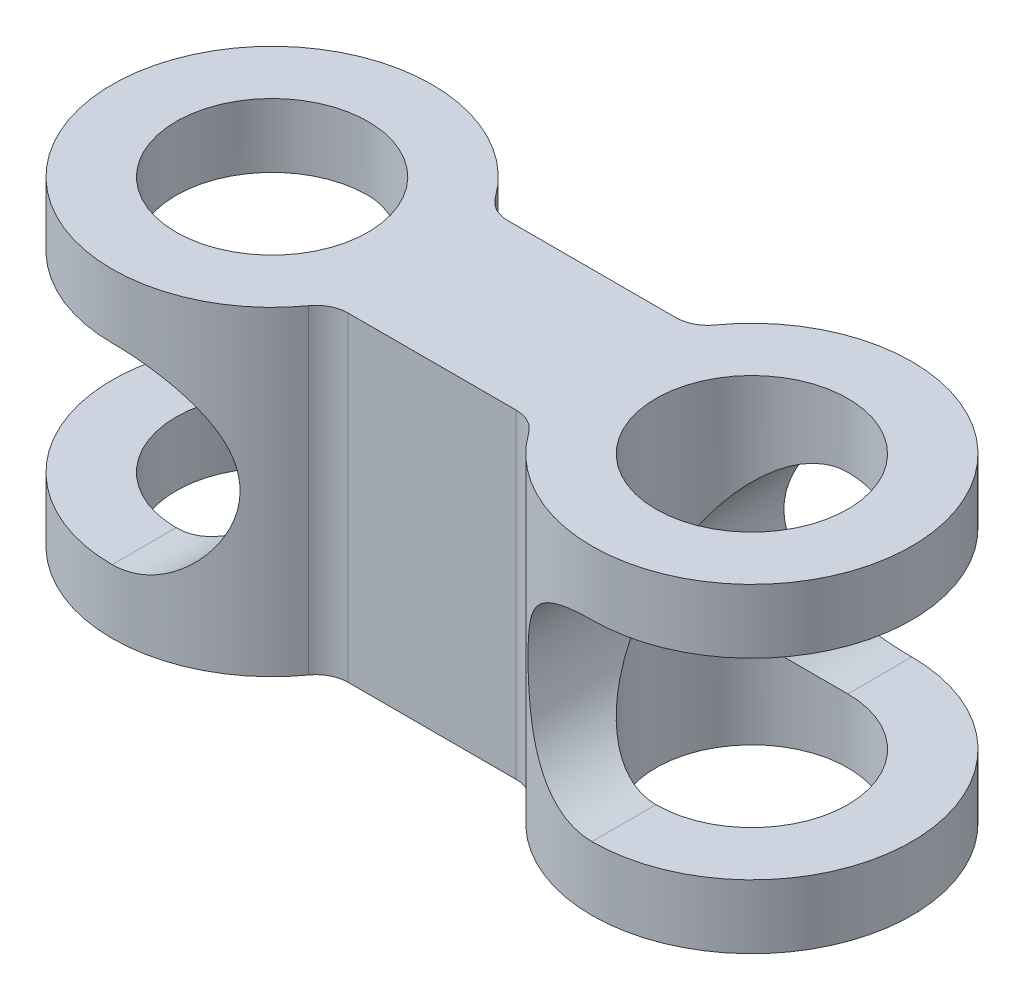
ISO-10303-21;
HEADER;
FILE_DESCRIPTION(('STEP AP214'),'2;1');
FILE_NAME('part.step','',(''),(''),'','','');
FILE_SCHEMA(('AUTOMOTIVE_DESIGN { 1 0 10303 214 1 1 1 1 }'));
ENDSEC;
DATA;
#1=APPLICATION_CONTEXT('core data for automotive mechanical design processes');
#2=APPLICATION_PROTOCOL_DEFINITION('international standard','automotive_design',2000,#1);
#3=PRODUCT_CONTEXT('',#1,'mechanical');
#4=PRODUCT('Part','Part','',(#3));
#5=PRODUCT_RELATED_PRODUCT_CATEGORY('part','',(#4));
#6=PRODUCT_DEFINITION_FORMATION('','',#4);
#7=PRODUCT_DEFINITION_CONTEXT('part definition',#1,'design');
#8=PRODUCT_DEFINITION('design','',#6,#7);
#9=PRODUCT_DEFINITION_SHAPE('','',#8);
#10=(LENGTH_UNIT() NAMED_UNIT(*) SI_UNIT(.MILLI.,.METRE.));
#11=(NAMED_UNIT(*) PLANE_ANGLE_UNIT() SI_UNIT($,.RADIAN.));
#12=(NAMED_UNIT(*) SI_UNIT($,.STERADIAN.) SOLID_ANGLE_UNIT());
#13=UNCERTAINTY_MEASURE_WITH_UNIT(LENGTH_MEASURE(1.E-05),#10,'distance_accuracy_value','');
#14=(GEOMETRIC_REPRESENTATION_CONTEXT(3) GLOBAL_UNCERTAINTY_ASSIGNED_CONTEXT((#13)) GLOBAL_UNIT_ASSIGNED_CONTEXT((#10,
#11,#12)) REPRESENTATION_CONTEXT('',''));
#15=CARTESIAN_POINT('',(0.,0.,0.));
#16=DIRECTION('',(0.,0.,1.));
#17=DIRECTION('',(1.,0.,0.));
#18=AXIS2_PLACEMENT_3D('',#15,#16,#17);
#19=CARTESIAN_POINT('',(15.,24.142135623731,0.));
#20=DIRECTION('',(0.,-1.,0.));
#21=DIRECTION('',(0.,0.,-1.));
#22=AXIS2_PLACEMENT_3D('',#19,#20,#21);
#23=CYLINDRICAL_SURFACE('',#22,5.);
#24=CARTESIAN_POINT('',(15.,0.,0.));
#25=DIRECTION('',(0.,-1.,0.));
#26=DIRECTION('',(0.,0.,1.));
#27=AXIS2_PLACEMENT_3D('',#24,#25,#26);
#28=CIRCLE('',#27,5.);
#29=CARTESIAN_POINT('',(10.9388356896629,0.,-2.91666666666667));
#30=VERTEX_POINT('',#29);
#31=CARTESIAN_POINT('',(10.9388356896629,0.,2.91666666666667));
#32=VERTEX_POINT('',#31);
#33=EDGE_CURVE('E254',#30,#32,#28,.T.);
#34=ORIENTED_EDGE('',*,*,#33,.F.);
#35=DIRECTION('',(0.,-1.,0.));
#36=VECTOR('',#35,1.);
#37=CARTESIAN_POINT('',(10.9388356896629,24.142135623731,-2.91666666666667));
#38=LINE('',#37,#36);
#39=CARTESIAN_POINT('',(10.9388356896629,10.,-2.91666666666667));
#40=VERTEX_POINT('',#39);
#41=EDGE_CURVE('E234',#30,#40,#38,.F.);
#42=ORIENTED_EDGE('',*,*,#41,.T.);
#43=CARTESIAN_POINT('',(15.,10.,0.));
#44=DIRECTION('',(0.,1.,0.));
#45=DIRECTION('',(0.,0.,1.));
#46=AXIS2_PLACEMENT_3D('',#43,#44,#45);
#47=CIRCLE('',#46,5.);
#48=CARTESIAN_POINT('',(10.9388356896629,10.,2.91666666666667));
#49=VERTEX_POINT('',#48);
#50=EDGE_CURVE('E247',#40,#49,#47,.F.);
#51=ORIENTED_EDGE('',*,*,#50,.T.);
#52=DIRECTION('',(0.,-1.,0.));
#53=VECTOR('',#52,1.);
#54=CARTESIAN_POINT('',(10.9388356896629,24.142135623731,2.91666666666667));
#55=LINE('',#54,#53);
#56=EDGE_CURVE('E228',#49,#32,#55,.T.);
#57=ORIENTED_EDGE('',*,*,#56,.T.);
#58=EDGE_LOOP('',(#34,#42,#51,#57));
#59=FACE_BOUND('',#58,.T.);
#60=CARTESIAN_POINT('',(15.,2.,0.));
#61=DIRECTION('',(0.,1.,0.));
#62=DIRECTION('',(0.,0.,1.));
#63=AXIS2_PLACEMENT_3D('',#60,#61,#62);
#64=CIRCLE('',#63,5.);
#65=CARTESIAN_POINT('',(15.,2.,-5.));
#66=VERTEX_POINT('',#65);
#67=CARTESIAN_POINT('',(15.,2.,5.));
#68=VERTEX_POINT('',#67);
#69=EDGE_CURVE('E165',#66,#68,#64,.F.);
#70=ORIENTED_EDGE('',*,*,#69,.T.);
#71=CARTESIAN_POINT('',(15.,2.,5.));
#72=CARTESIAN_POINT('',(14.9228585937771,1.99998597646933,5.00001550025202));
#73=CARTESIAN_POINT('',(14.8457275597749,2.00297495614088,4.99821520229097));
#74=CARTESIAN_POINT('',(14.692121870267,2.01485011540271,4.99109993407428));
#75=CARTESIAN_POINT('',(14.6156469032461,2.02373331905781,4.98578673745113));
#76=CARTESIAN_POINT('',(14.4643284608028,2.04722335139537,4.97180106040882));
#77=CARTESIAN_POINT('',(14.389478312618,2.06179833605021,4.96314727276862));
#78=CARTESIAN_POINT('',(14.2415214252585,2.09646919116128,4.94270141798681));
#79=CARTESIAN_POINT('',(14.1684148313508,2.11656551990202,4.93090909034155));
#80=CARTESIAN_POINT('',(13.9526842479204,2.18472088186145,4.89125830601941));
#81=CARTESIAN_POINT('',(13.8132617471665,2.24070789743841,4.85908815996066));
#82=CARTESIAN_POINT('',(13.5461011386273,2.3716176684363,4.78596424168129));
#83=CARTESIAN_POINT('',(13.4183771554995,2.44656291377018,4.7450000459856));
#84=CARTESIAN_POINT('',(13.1673962656669,2.61955630237699,4.65410357289328));
#85=CARTESIAN_POINT('',(13.0452116546344,2.71892495573595,4.60372689949431));
#86=CARTESIAN_POINT('',(12.8182139016428,2.93495586170392,4.50059910222951));
#87=CARTESIAN_POINT('',(12.7134202081901,3.05163720290322,4.44784540278803));
#88=CARTESIAN_POINT('',(12.511100141072,3.315847534088,4.33822112695084));
#89=CARTESIAN_POINT('',(12.4160439319938,3.46540491043497,4.28163983678159));
#90=CARTESIAN_POINT('',(12.2527704488638,3.78169475257987,4.17876557612389));
#91=CARTESIAN_POINT('',(12.1845093680399,3.9483986179599,4.13245586723177));
#92=CARTESIAN_POINT('',(12.0911882613031,4.2531920164544,4.06709278390524));
#93=CARTESIAN_POINT('',(12.0596764821942,4.38847018672846,4.04415796840962));
#94=CARTESIAN_POINT('',(12.0156767146196,4.66360556449641,4.01180629314329));
#95=CARTESIAN_POINT('',(12.0031653257232,4.80345692244881,4.00237280628201));
#96=CARTESIAN_POINT('',(11.9978898190188,5.08402329607606,3.99841844471282));
#97=CARTESIAN_POINT('',(12.0051643610586,5.22473946578421,4.00392676483381));
#98=CARTESIAN_POINT('',(12.0390789097342,5.50255815138851,4.02906531443466));
#99=CARTESIAN_POINT('',(12.0657333982454,5.63965788542614,4.04870610444229));
#100=CARTESIAN_POINT('',(12.1365216853842,5.905060991022,4.09906383497498));
#101=CARTESIAN_POINT('',(12.1804253179506,6.03345509247912,4.12963446700525));
#102=CARTESIAN_POINT('',(12.2840992764309,6.28139091760368,4.19854132676723));
#103=CARTESIAN_POINT('',(12.343875296557,6.40092944461436,4.23688034023069));
#104=CARTESIAN_POINT('',(12.4896379178928,6.64996438777623,4.32510519863025));
#105=CARTESIAN_POINT('',(12.5783796796568,6.77754888055254,4.37583797623969));
#106=CARTESIAN_POINT('',(12.7741729935459,7.01734682172302,4.47860912189424));
#107=CARTESIAN_POINT('',(12.8812430655461,7.12954451390759,4.53064876462921));
#108=CARTESIAN_POINT('',(13.1283921576648,7.3512428092642,4.63871841685804));
#109=CARTESIAN_POINT('',(13.2709923163763,7.45818376580063,4.69429237571026));
#110=CARTESIAN_POINT('',(13.5755106483022,7.6462708189549,4.79546297464963));
#111=CARTESIAN_POINT('',(13.7374126578633,7.72743829285295,4.8410678735314));
#112=CARTESIAN_POINT('',(14.0433950550039,7.84718368139444,4.90963920598383));
#113=CARTESIAN_POINT('',(14.1848516015556,7.89096615665479,4.93527978090391));
#114=CARTESIAN_POINT('',(14.4741319263094,7.9572536874028,4.97439606890041));
#115=CARTESIAN_POINT('',(14.6219393454,7.97981034209432,4.98790127898447));
#116=CARTESIAN_POINT('',(14.8088302600745,7.99414964789044,4.9964921244036));
#117=CARTESIAN_POINT('',(14.8470374632551,7.99634348382761,4.99780705222993));
#118=CARTESIAN_POINT('',(14.9234917006134,7.99926683955921,4.9995597588117));
#119=CARTESIAN_POINT('',(14.9617386627547,7.99999774476819,4.99999836745218));
#120=CARTESIAN_POINT('',(15.,8.,5.));
#121=B_SPLINE_CURVE_WITH_KNOTS('',3,(#71,#72,#73,#74,#75,#76,#77,#78,#79,#80,#81,#82,#83,#84,
#85,#86,#87,#88,#89,#90,#91,#92,#93,#94,#95,#96,#97,#98,#99,#100,#101,#102,#103,#104,#105,#106,
#107,#108,#109,#110,#111,#112,#113,#114,#115,#116,#117,#118,#119,#120),.UNSPECIFIED.,.F.,.F.,(4,
2,2,2,2,2,2,2,2,2,2,2,2,2,2,2,2,2,2,2,2,2,2,2,4),(0.,0.231328240228349,0.462539773905629,
0.692475856222485,0.922431029541971,1.38117325985713,1.84046226360277,2.33456219846009,
2.82921102203629,3.38456472801073,3.93900667869519,4.35955966268464,4.77959428233625,
5.20045019939585,5.62162092924994,6.03735282155267,6.45323405946918,6.9418120944976,
7.43088676014279,7.98818745066573,8.54502468491722,8.99398548375875,9.44185203395278,
9.55670668456524,9.67145251475948),.UNSPECIFIED.);
#122=CARTESIAN_POINT('',(15.,8.,5.));
#123=VERTEX_POINT('',#122);
#124=EDGE_CURVE('E171',#68,#123,#121,.T.);
#125=ORIENTED_EDGE('',*,*,#124,.T.);
#126=CARTESIAN_POINT('',(15.,8.,0.));
#127=DIRECTION('',(0.,-1.,0.));
#128=DIRECTION('',(0.,0.,-1.));
#129=AXIS2_PLACEMENT_3D('',#126,#127,#128);
#130=CIRCLE('',#129,5.);
#131=CARTESIAN_POINT('',(15.,8.,-5.));
#132=VERTEX_POINT('',#131);
#133=EDGE_CURVE('E153',#123,#132,#130,.F.);
#134=ORIENTED_EDGE('',*,*,#133,.T.);
#135=CARTESIAN_POINT('',(15.,8.,-5.));
#136=CARTESIAN_POINT('',(14.9228585937771,8.00001402353067,-5.00001550025202));
#137=CARTESIAN_POINT('',(14.8457275597749,7.99702504385912,-4.99821520229097));
#138=CARTESIAN_POINT('',(14.692121870267,7.98514988459729,-4.99109993407428));
#139=CARTESIAN_POINT('',(14.6156469032461,7.97626668094219,-4.98578673745113));
#140=CARTESIAN_POINT('',(14.4643284608028,7.95277664860463,-4.97180106040882));
#141=CARTESIAN_POINT('',(14.389478312618,7.93820166394979,-4.96314727276862));
#142=CARTESIAN_POINT('',(14.2415214252585,7.90353080883872,-4.94270141798681));
#143=CARTESIAN_POINT('',(14.1684148313508,7.88343448009798,-4.93090909034155));
#144=CARTESIAN_POINT('',(13.9526842479204,7.81527911813855,-4.89125830601941));
#145=CARTESIAN_POINT('',(13.8132617471665,7.75929210256159,-4.85908815996066));
#146=CARTESIAN_POINT('',(13.5461011386273,7.6283823315637,-4.78596424168129));
#147=CARTESIAN_POINT('',(13.4183771554995,7.55343708622982,-4.7450000459856));
#148=CARTESIAN_POINT('',(13.1673962656669,7.38044369762301,-4.65410357289328));
#149=CARTESIAN_POINT('',(13.0452116546344,7.28107504426405,-4.60372689949431));
#150=CARTESIAN_POINT('',(12.8182139016428,7.06504413829608,-4.50059910222951));
#151=CARTESIAN_POINT('',(12.7134202081901,6.94836279709678,-4.44784540278803));
#152=CARTESIAN_POINT('',(12.511100141072,6.684152465912,-4.33822112695084));
#153=CARTESIAN_POINT('',(12.4160439319938,6.53459508956503,-4.28163983678159));
#154=CARTESIAN_POINT('',(12.2527704488638,6.21830524742013,-4.17876557612389));
#155=CARTESIAN_POINT('',(12.1845093680399,6.0516013820401,-4.13245586723177));
#156=CARTESIAN_POINT('',(12.0911882613031,5.7468079835456,-4.06709278390524));
#157=CARTESIAN_POINT('',(12.0596764821942,5.61152981327154,-4.04415796840962));
#158=CARTESIAN_POINT('',(12.0156767146196,5.33639443550359,-4.01180629314329));
#159=CARTESIAN_POINT('',(12.0031653257232,5.19654307755119,-4.00237280628201));
#160=CARTESIAN_POINT('',(11.9978898190188,4.91597670392394,-3.99841844471282));
#161=CARTESIAN_POINT('',(12.0051643610586,4.77526053421579,-4.00392676483381));
#162=CARTESIAN_POINT('',(12.0390789097342,4.49744184861149,-4.02906531443466));
#163=CARTESIAN_POINT('',(12.0657333982454,4.36034211457386,-4.04870610444229));
#164=CARTESIAN_POINT('',(12.1365216853842,4.094939008978,-4.09906383497498));
#165=CARTESIAN_POINT('',(12.1804253179506,3.96654490752088,-4.12963446700525));
#166=CARTESIAN_POINT('',(12.2840992764309,3.71860908239632,-4.19854132676723));
#167=CARTESIAN_POINT('',(12.343875296557,3.59907055538564,-4.23688034023069));
#168=CARTESIAN_POINT('',(12.4896379178928,3.35003561222377,-4.32510519863025));
#169=CARTESIAN_POINT('',(12.5783796796568,3.22245111944747,-4.37583797623969));
#170=CARTESIAN_POINT('',(12.7741729935459,2.98265317827698,-4.47860912189424));
#171=CARTESIAN_POINT('',(12.8812430655461,2.87045548609241,-4.53064876462921));
#172=CARTESIAN_POINT('',(13.1283921576648,2.6487571907358,-4.63871841685804));
#173=CARTESIAN_POINT('',(13.2709923163763,2.54181623419937,-4.69429237571026));
#174=CARTESIAN_POINT('',(13.5755106483022,2.3537291810451,-4.79546297464963));
#175=CARTESIAN_POINT('',(13.7374126578633,2.27256170714705,-4.8410678735314));
#176=CARTESIAN_POINT('',(14.0433950550039,2.15281631860556,-4.90963920598383));
#177=CARTESIAN_POINT('',(14.1848516015556,2.10903384334521,-4.93527978090391));
#178=CARTESIAN_POINT('',(14.4741319263094,2.0427463125972,-4.97439606890041));
#179=CARTESIAN_POINT('',(14.6219393454,2.02018965790568,-4.98790127898447));
#180=CARTESIAN_POINT('',(14.8088302600745,2.00585035210956,-4.9964921244036));
#181=CARTESIAN_POINT('',(14.8470374632551,2.00365651617239,-4.99780705222993));
#182=CARTESIAN_POINT('',(14.9234917006134,2.00073316044079,-4.9995597588117));
#183=CARTESIAN_POINT('',(14.9617386627547,2.00000225523181,-4.99999836745218));
#184=CARTESIAN_POINT('',(15.,2.,-5.));
#185=B_SPLINE_CURVE_WITH_KNOTS('',3,(#135,#136,#137,#138,#139,#140,#141,#142,#143,#144,#145,
#146,#147,#148,#149,#150,#151,#152,#153,#154,#155,#156,#157,#158,#159,#160,#161,#162,#163,#164,
#165,#166,#167,#168,#169,#170,#171,#172,#173,#174,#175,#176,#177,#178,#179,#180,#181,#182,#183,
#184),.UNSPECIFIED.,.F.,.F.,(4,2,2,2,2,2,2,2,2,2,2,2,2,2,2,2,2,2,2,2,2,2,2,2,4),(0.,
0.231328240228349,0.462539773905629,0.692475856222483,0.922431029541971,1.38117325985713,
1.84046226360277,2.33456219846009,2.82921102203629,3.38456472801073,3.93900667869519,
4.35955966268464,4.77959428233625,5.20045019939585,5.62162092924994,6.03735282155266,
6.45323405946918,6.9418120944976,7.43088676014279,7.98818745066573,8.54502468491722,
8.99398548375875,9.44185203395278,9.55670668456524,9.67145251475948),.UNSPECIFIED.);
#186=EDGE_CURVE('E164',#132,#66,#185,.T.);
#187=ORIENTED_EDGE('',*,*,#186,.T.);
#188=EDGE_LOOP('',(#70,#125,#134,#187));
#189=FACE_BOUND('',#188,.T.);
#190=ADVANCED_FACE('F35',(#59,#189),#23,.T.);
#191=CARTESIAN_POINT('',(15.,10.001,0.));
#192=DIRECTION('',(0.,-1.,0.));
#193=DIRECTION('',(0.,0.,-1.));
#194=AXIS2_PLACEMENT_3D('',#191,#192,#193);
#195=CYLINDRICAL_SURFACE('',#194,3.);
#196=CARTESIAN_POINT('',(15.,10.,0.));
#197=DIRECTION('',(0.,1.,0.));
#198=DIRECTION('',(0.,0.,1.));
#199=AXIS2_PLACEMENT_3D('',#196,#197,#198);
#200=CIRCLE('',#199,3.);
#201=CARTESIAN_POINT('',(15.,10.,3.));
#202=VERTEX_POINT('',#201);
#203=EDGE_CURVE('E179',#202,#202,#200,.F.);
#204=ORIENTED_EDGE('',*,*,#203,.F.);
#205=EDGE_LOOP('',(#204));
#206=FACE_BOUND('',#205,.T.);
#207=CARTESIAN_POINT('',(15.,5.,0.));
#208=DIRECTION('',(0.,-0.707106781186547,-0.707106781186547));
#209=DIRECTION('',(0.,-0.707106781186547,0.707106781186547));
#210=AXIS2_PLACEMENT_3D('',#207,#208,#209);
#211=ELLIPSE('',#210,4.24264068711928,3.);
#212=CARTESIAN_POINT('',(15.,8.,-3.));
#213=VERTEX_POINT('',#212);
#214=CARTESIAN_POINT('',(12.,5.,0.));
#215=VERTEX_POINT('',#214);
#216=EDGE_CURVE('E221',#213,#215,#211,.F.);
#217=ORIENTED_EDGE('',*,*,#216,.F.);
#218=CARTESIAN_POINT('',(15.,8.,0.));
#219=DIRECTION('',(0.,-1.,0.));
#220=DIRECTION('',(0.,0.,-1.));
#221=AXIS2_PLACEMENT_3D('',#218,#219,#220);
#222=CIRCLE('',#221,3.);
#223=CARTESIAN_POINT('',(15.,8.,3.));
#224=VERTEX_POINT('',#223);
#225=EDGE_CURVE('E222',#224,#213,#222,.F.);
#226=ORIENTED_EDGE('',*,*,#225,.F.);
#227=CARTESIAN_POINT('',(15.,5.,0.));
#228=DIRECTION('',(0.,-0.707106781186547,0.707106781186547));
#229=DIRECTION('',(0.,-0.707106781186547,-0.707106781186547));
#230=AXIS2_PLACEMENT_3D('',#227,#228,#229);
#231=ELLIPSE('',#230,4.24264068711928,3.);
#232=EDGE_CURVE('E174',#215,#224,#231,.F.);
#233=ORIENTED_EDGE('',*,*,#232,.F.);
#234=EDGE_LOOP('',(#217,#226,#233));
#235=FACE_BOUND('',#234,.T.);
#236=ADVANCED_FACE('F206',(#206,#235),#195,.F.);
#237=CARTESIAN_POINT('',(15.,0.,0.));
#238=DIRECTION('',(0.,-1.,0.));
#239=DIRECTION('',(0.,0.,1.));
#240=AXIS2_PLACEMENT_3D('',#237,#238,#239);
#241=CIRCLE('',#240,3.);
#242=CARTESIAN_POINT('',(15.,0.,3.));
#243=VERTEX_POINT('',#242);
#244=EDGE_CURVE('E182',#243,#243,#241,.T.);
#245=ORIENTED_EDGE('',*,*,#244,.T.);
#246=EDGE_LOOP('',(#245));
#247=FACE_BOUND('',#246,.T.);
#248=CARTESIAN_POINT('',(15.,5.,0.));
#249=DIRECTION('',(0.,-0.707106781186547,0.707106781186547));
#250=DIRECTION('',(0.,-0.707106781186547,-0.707106781186547));
#251=AXIS2_PLACEMENT_3D('',#248,#249,#250);
#252=ELLIPSE('',#251,4.24264068711928,3.);
#253=CARTESIAN_POINT('',(15.,2.,-3.));
#254=VERTEX_POINT('',#253);
#255=EDGE_CURVE('E311',#215,#254,#252,.T.);
#256=ORIENTED_EDGE('',*,*,#255,.F.);
#257=CARTESIAN_POINT('',(15.,5.,0.));
#258=DIRECTION('',(0.,-0.707106781186547,-0.707106781186547));
#259=DIRECTION('',(0.,-0.707106781186547,0.707106781186547));
#260=AXIS2_PLACEMENT_3D('',#257,#258,#259);
#261=ELLIPSE('',#260,4.24264068711928,3.);
#262=CARTESIAN_POINT('',(15.,2.,3.));
#263=VERTEX_POINT('',#262);
#264=EDGE_CURVE('E309',#263,#215,#261,.T.);
#265=ORIENTED_EDGE('',*,*,#264,.F.);
#266=CARTESIAN_POINT('',(15.,2.,0.));
#267=DIRECTION('',(0.,1.,0.));
#268=DIRECTION('',(0.,0.,1.));
#269=AXIS2_PLACEMENT_3D('',#266,#267,#268);
#270=CIRCLE('',#269,3.);
#271=EDGE_CURVE('E307',#254,#263,#270,.F.);
#272=ORIENTED_EDGE('',*,*,#271,.F.);
#273=EDGE_LOOP('',(#256,#265,#272));
#274=FACE_BOUND('',#273,.T.);
#275=ADVANCED_FACE('F209',(#247,#274),#195,.F.);
#276=CARTESIAN_POINT('',(0.,24.142135623731,0.));
#277=DIRECTION('',(0.,-1.,0.));
#278=DIRECTION('',(0.,0.,-1.));
#279=AXIS2_PLACEMENT_3D('',#276,#277,#278);
#280=CYLINDRICAL_SURFACE('',#279,5.);
#281=CARTESIAN_POINT('',(0.,10.,0.));
#282=DIRECTION('',(0.,1.,0.));
#283=DIRECTION('',(0.,0.,1.));
#284=AXIS2_PLACEMENT_3D('',#281,#282,#283);
#285=CIRCLE('',#284,5.);
#286=CARTESIAN_POINT('',(4.06116431033707,10.,-2.91666666666667));
#287=VERTEX_POINT('',#286);
#288=CARTESIAN_POINT('',(4.06116431033707,10.,2.91666666666667));
#289=VERTEX_POINT('',#288);
#290=EDGE_CURVE('E263',#287,#289,#285,.T.);
#291=ORIENTED_EDGE('',*,*,#290,.F.);
#292=DIRECTION('',(0.,-1.,0.));
#293=VECTOR('',#292,1.);
#294=CARTESIAN_POINT('',(4.06116431033707,24.142135623731,-2.91666666666667));
#295=LINE('',#294,#293);
#296=CARTESIAN_POINT('',(4.06116431033707,0.,-2.91666666666667));
#297=VERTEX_POINT('',#296);
#298=EDGE_CURVE('E291',#287,#297,#295,.T.);
#299=ORIENTED_EDGE('',*,*,#298,.T.);
#300=CARTESIAN_POINT('',(0.,0.,0.));
#301=DIRECTION('',(0.,1.,0.));
#302=DIRECTION('',(0.,0.,1.));
#303=AXIS2_PLACEMENT_3D('',#300,#301,#302);
#304=CIRCLE('',#303,5.);
#305=CARTESIAN_POINT('',(4.06116431033707,0.,2.91666666666667));
#306=VERTEX_POINT('',#305);
#307=EDGE_CURVE('E267',#297,#306,#304,.T.);
#308=ORIENTED_EDGE('',*,*,#307,.T.);
#309=DIRECTION('',(0.,-1.,0.));
#310=VECTOR('',#309,1.);
#311=CARTESIAN_POINT('',(4.06116431033707,24.142135623731,2.91666666666667));
#312=LINE('',#311,#310);
#313=EDGE_CURVE('E288',#306,#289,#312,.F.);
#314=ORIENTED_EDGE('',*,*,#313,.T.);
#315=EDGE_LOOP('',(#291,#299,#308,#314));
#316=FACE_BOUND('',#315,.T.);
#317=CARTESIAN_POINT('',(0.,8.,0.));
#318=DIRECTION('',(0.,1.,0.));
#319=DIRECTION('',(0.,0.,1.));
#320=AXIS2_PLACEMENT_3D('',#317,#318,#319);
#321=CIRCLE('',#320,5.);
#322=CARTESIAN_POINT('',(0.,8.,-5.));
#323=VERTEX_POINT('',#322);
#324=CARTESIAN_POINT('',(0.,8.,5.));
#325=VERTEX_POINT('',#324);
#326=EDGE_CURVE('E569',#323,#325,#321,.T.);
#327=ORIENTED_EDGE('',*,*,#326,.T.);
#328=CARTESIAN_POINT('',(0.,8.,5.));
#329=CARTESIAN_POINT('',(0.0771414062228746,8.00001402353067,5.00001550025202));
#330=CARTESIAN_POINT('',(0.154272440225103,7.99702504385912,4.99821520229097));
#331=CARTESIAN_POINT('',(0.307878129733011,7.98514988459729,4.99109993407428));
#332=CARTESIAN_POINT('',(0.384353096753867,7.97626668094219,4.98578673745113));
#333=CARTESIAN_POINT('',(0.535671539197178,7.95277664860463,4.97180106040882));
#334=CARTESIAN_POINT('',(0.610521687382044,7.93820166394979,4.96314727276862));
#335=CARTESIAN_POINT('',(0.758478574741453,7.90353080883872,4.94270141798681));
#336=CARTESIAN_POINT('',(0.831585168649239,7.88343448009798,4.93090909034155));
#337=CARTESIAN_POINT('',(1.04731575207964,7.81527911813855,4.89125830601941));
#338=CARTESIAN_POINT('',(1.18673825283346,7.75929210256159,4.85908815996066));
#339=CARTESIAN_POINT('',(1.45389886137266,7.6283823315637,4.78596424168129));
#340=CARTESIAN_POINT('',(1.58162284450045,7.55343708622982,4.7450000459856));
#341=CARTESIAN_POINT('',(1.83260373433312,7.38044369762301,4.65410357289328));
#342=CARTESIAN_POINT('',(1.95478834536559,7.28107504426405,4.60372689949431));
#343=CARTESIAN_POINT('',(2.18178609835724,7.06504413829608,4.50059910222951));
#344=CARTESIAN_POINT('',(2.28657979180989,6.94836279709678,4.44784540278803));
#345=CARTESIAN_POINT('',(2.48889985892796,6.684152465912,4.33822112695084));
#346=CARTESIAN_POINT('',(2.58395606800625,6.53459508956503,4.28163983678159));
#347=CARTESIAN_POINT('',(2.74722955113622,6.21830524742013,4.17876557612389));
#348=CARTESIAN_POINT('',(2.81549063196008,6.0516013820401,4.13245586723177));
#349=CARTESIAN_POINT('',(2.90881173869686,5.7468079835456,4.06709278390524));
#350=CARTESIAN_POINT('',(2.94032351780584,5.61152981327154,4.04415796840962));
#351=CARTESIAN_POINT('',(2.98432328538044,5.33639443550359,4.01180629314329));
#352=CARTESIAN_POINT('',(2.99683467427683,5.19654307755119,4.00237280628201));
#353=CARTESIAN_POINT('',(3.00211018098124,4.91597670392393,3.99841844471282));
#354=CARTESIAN_POINT('',(2.99483563894143,4.77526053421578,4.00392676483381));
#355=CARTESIAN_POINT('',(2.96092109026582,4.49744184861149,4.02906531443466));
#356=CARTESIAN_POINT('',(2.93426660175463,4.36034211457386,4.04870610444229));
#357=CARTESIAN_POINT('',(2.86347831461583,4.09493900897799,4.09906383497498));
#358=CARTESIAN_POINT('',(2.81957468204943,3.96654490752088,4.12963446700525));
#359=CARTESIAN_POINT('',(2.71590072356911,3.71860908239632,4.19854132676723));
#360=CARTESIAN_POINT('',(2.65612470344299,3.59907055538564,4.23688034023069));
#361=CARTESIAN_POINT('',(2.5103620821072,3.35003561222377,4.32510519863025));
#362=CARTESIAN_POINT('',(2.42162032034318,3.22245111944746,4.37583797623969));
#363=CARTESIAN_POINT('',(2.22582700645413,2.98265317827698,4.47860912189424));
#364=CARTESIAN_POINT('',(2.11875693445392,2.87045548609241,4.53064876462921));
#365=CARTESIAN_POINT('',(1.87160784233521,2.6487571907358,4.63871841685804));
#366=CARTESIAN_POINT('',(1.72900768362372,2.54181623419937,4.69429237571026));
#367=CARTESIAN_POINT('',(1.42448935169784,2.3537291810451,4.79546297464963));
#368=CARTESIAN_POINT('',(1.26258734213673,2.27256170714705,4.8410678735314));
#369=CARTESIAN_POINT('',(0.956604944996132,2.15281631860556,4.90963920598383));
#370=CARTESIAN_POINT('',(0.815148398444378,2.10903384334521,4.93527978090391));
#371=CARTESIAN_POINT('',(0.525868073690555,2.0427463125972,4.97439606890041));
#372=CARTESIAN_POINT('',(0.378060654599952,2.02018965790568,4.98790127898447));
#373=CARTESIAN_POINT('',(0.191169739925511,2.00585035210956,4.9964921244036));
#374=CARTESIAN_POINT('',(0.152962536744894,2.00365651617239,4.99780705222993));
#375=CARTESIAN_POINT('',(0.0765082993865988,2.00073316044079,4.9995597588117));
#376=CARTESIAN_POINT('',(0.0382613372452819,2.00000225523181,4.99999836745218));
#377=CARTESIAN_POINT('',(0.,2.,5.));
#378=B_SPLINE_CURVE_WITH_KNOTS('',3,(#328,#329,#330,#331,#332,#333,#334,#335,#336,#337,#338,
#339,#340,#341,#342,#343,#344,#345,#346,#347,#348,#349,#350,#351,#352,#353,#354,#355,#356,#357,
#358,#359,#360,#361,#362,#363,#364,#365,#366,#367,#368,#369,#370,#371,#372,#373,#374,#375,#376,
#377),.UNSPECIFIED.,.F.,.F.,(4,2,2,2,2,2,2,2,2,2,2,2,2,2,2,2,2,2,2,2,2,2,2,2,4),(0.,
0.23132824022835,0.462539773905629,0.692475856222485,0.922431029541972,1.38117325985713,
1.84046226360277,2.33456219846009,2.8292110220363,3.38456472801074,3.9390066786952,
4.35955966268464,4.77959428233625,5.20045019939585,5.62162092924995,6.03735282155267,
6.45323405946919,6.94181209449761,7.4308867601428,7.98818745066573,8.54502468491722,
8.99398548375876,9.44185203395279,9.55670668456525,9.67145251475948),.UNSPECIFIED.);
#379=CARTESIAN_POINT('',(0.,2.,5.));
#380=VERTEX_POINT('',#379);
#381=EDGE_CURVE('E538',#325,#380,#378,.T.);
#382=ORIENTED_EDGE('',*,*,#381,.T.);
#383=CARTESIAN_POINT('',(0.,2.,0.));
#384=DIRECTION('',(0.,-1.,0.));
#385=DIRECTION('',(0.,0.,-1.));
#386=AXIS2_PLACEMENT_3D('',#383,#384,#385);
#387=CIRCLE('',#386,5.);
#388=CARTESIAN_POINT('',(0.,2.,-5.));
#389=VERTEX_POINT('',#388);
#390=EDGE_CURVE('E573',#380,#389,#387,.T.);
#391=ORIENTED_EDGE('',*,*,#390,.T.);
#392=CARTESIAN_POINT('',(0.,2.,-5.));
#393=CARTESIAN_POINT('',(0.0771414062228742,1.99998597646933,-5.00001550025202));
#394=CARTESIAN_POINT('',(0.154272440225103,2.00297495614088,-4.99821520229097));
#395=CARTESIAN_POINT('',(0.30787812973301,2.01485011540271,-4.99109993407428));
#396=CARTESIAN_POINT('',(0.384353096753867,2.02373331905781,-4.98578673745113));
#397=CARTESIAN_POINT('',(0.535671539197177,2.04722335139537,-4.97180106040882));
#398=CARTESIAN_POINT('',(0.610521687382042,2.06179833605021,-4.96314727276862));
#399=CARTESIAN_POINT('',(0.758478574741452,2.09646919116128,-4.94270141798681));
#400=CARTESIAN_POINT('',(0.831585168649238,2.11656551990202,-4.93090909034155));
#401=CARTESIAN_POINT('',(1.04731575207964,2.18472088186145,-4.89125830601941));
#402=CARTESIAN_POINT('',(1.18673825283346,2.24070789743841,-4.85908815996066));
#403=CARTESIAN_POINT('',(1.45389886137266,2.3716176684363,-4.78596424168129));
#404=CARTESIAN_POINT('',(1.58162284450045,2.44656291377018,-4.7450000459856));
#405=CARTESIAN_POINT('',(1.83260373433312,2.61955630237699,-4.65410357289328));
#406=CARTESIAN_POINT('',(1.95478834536558,2.71892495573595,-4.60372689949431));
#407=CARTESIAN_POINT('',(2.18178609835724,2.93495586170392,-4.50059910222951));
#408=CARTESIAN_POINT('',(2.28657979180989,3.05163720290322,-4.44784540278803));
#409=CARTESIAN_POINT('',(2.48889985892796,3.315847534088,-4.33822112695084));
#410=CARTESIAN_POINT('',(2.58395606800625,3.46540491043497,-4.28163983678159));
#411=CARTESIAN_POINT('',(2.74722955113622,3.78169475257987,-4.17876557612389));
#412=CARTESIAN_POINT('',(2.81549063196008,3.9483986179599,-4.13245586723177));
#413=CARTESIAN_POINT('',(2.90881173869686,4.2531920164544,-4.06709278390524));
#414=CARTESIAN_POINT('',(2.94032351780584,4.38847018672846,-4.04415796840962));
#415=CARTESIAN_POINT('',(2.98432328538044,4.66360556449641,-4.01180629314329));
#416=CARTESIAN_POINT('',(2.99683467427683,4.80345692244881,-4.00237280628201));
#417=CARTESIAN_POINT('',(3.00211018098124,5.08402329607607,-3.99841844471282));
#418=CARTESIAN_POINT('',(2.99483563894143,5.22473946578422,-4.00392676483381));
#419=CARTESIAN_POINT('',(2.96092109026582,5.50255815138852,-4.02906531443466));
#420=CARTESIAN_POINT('',(2.93426660175463,5.63965788542615,-4.04870610444229));
#421=CARTESIAN_POINT('',(2.86347831461583,5.90506099102201,-4.09906383497498));
#422=CARTESIAN_POINT('',(2.81957468204943,6.03345509247912,-4.12963446700525));
#423=CARTESIAN_POINT('',(2.71590072356911,6.28139091760369,-4.19854132676723));
#424=CARTESIAN_POINT('',(2.65612470344299,6.40092944461437,-4.23688034023069));
#425=CARTESIAN_POINT('',(2.5103620821072,6.64996438777624,-4.32510519863025));
#426=CARTESIAN_POINT('',(2.42162032034318,6.77754888055254,-4.37583797623969));
#427=CARTESIAN_POINT('',(2.22582700645413,7.01734682172303,-4.47860912189424));
#428=CARTESIAN_POINT('',(2.11875693445392,7.12954451390759,-4.53064876462921));
#429=CARTESIAN_POINT('',(1.87160784233521,7.3512428092642,-4.63871841685804));
#430=CARTESIAN_POINT('',(1.72900768362372,7.45818376580063,-4.69429237571026));
#431=CARTESIAN_POINT('',(1.42448935169784,7.6462708189549,-4.79546297464963));
#432=CARTESIAN_POINT('',(1.26258734213673,7.72743829285295,-4.8410678735314));
#433=CARTESIAN_POINT('',(0.956604944996132,7.84718368139444,-4.90963920598383));
#434=CARTESIAN_POINT('',(0.815148398444377,7.89096615665479,-4.93527978090391));
#435=CARTESIAN_POINT('',(0.525868073690555,7.9572536874028,-4.97439606890041));
#436=CARTESIAN_POINT('',(0.378060654599951,7.97981034209432,-4.98790127898447));
#437=CARTESIAN_POINT('',(0.191169739925511,7.99414964789044,-4.9964921244036));
#438=CARTESIAN_POINT('',(0.152962536744894,7.99634348382761,-4.99780705222993));
#439=CARTESIAN_POINT('',(0.076508299386599,7.99926683955921,-4.9995597588117));
#440=CARTESIAN_POINT('',(0.0382613372452823,7.99999774476819,-4.99999836745218));
#441=CARTESIAN_POINT('',(0.,8.,-5.));
#442=B_SPLINE_CURVE_WITH_KNOTS('',3,(#392,#393,#394,#395,#396,#397,#398,#399,#400,#401,#402,
#403,#404,#405,#406,#407,#408,#409,#410,#411,#412,#413,#414,#415,#416,#417,#418,#419,#420,#421,
#422,#423,#424,#425,#426,#427,#428,#429,#430,#431,#432,#433,#434,#435,#436,#437,#438,#439,#440,
#441),.UNSPECIFIED.,.F.,.F.,(4,2,2,2,2,2,2,2,2,2,2,2,2,2,2,2,2,2,2,2,2,2,2,2,4),(0.,
0.23132824022835,0.462539773905629,0.692475856222484,0.922431029541972,1.38117325985713,
1.84046226360277,2.33456219846009,2.8292110220363,3.38456472801074,3.9390066786952,
4.35955966268464,4.77959428233625,5.20045019939585,5.62162092924995,6.03735282155267,
6.45323405946919,6.94181209449761,7.4308867601428,7.98818745066573,8.54502468491723,
8.99398548375876,9.44185203395279,9.55670668456525,9.67145251475948),.UNSPECIFIED.);
#443=EDGE_CURVE('E531',#389,#323,#442,.T.);
#444=ORIENTED_EDGE('',*,*,#443,.T.);
#445=EDGE_LOOP('',(#327,#382,#391,#444));
#446=FACE_BOUND('',#445,.T.);
#447=ADVANCED_FACE('F215',(#316,#446),#280,.T.);
#448=CARTESIAN_POINT('',(0.,10.001,0.));
#449=DIRECTION('',(0.,-1.,0.));
#450=DIRECTION('',(0.,0.,-1.));
#451=AXIS2_PLACEMENT_3D('',#448,#449,#450);
#452=CYLINDRICAL_SURFACE('',#451,3.);
#453=CARTESIAN_POINT('',(0.,5.,0.));
#454=DIRECTION('',(0.,-0.707106781186547,0.707106781186547));
#455=DIRECTION('',(0.,-0.707106781186547,-0.707106781186547));
#456=AXIS2_PLACEMENT_3D('',#453,#454,#455);
#457=ELLIPSE('',#456,4.24264068711928,3.);
#458=CARTESIAN_POINT('',(0.,2.,-3.));
#459=VERTEX_POINT('',#458);
#460=CARTESIAN_POINT('',(3.,5.,0.));
#461=VERTEX_POINT('',#460);
#462=EDGE_CURVE('E286',#459,#461,#457,.T.);
#463=ORIENTED_EDGE('',*,*,#462,.F.);
#464=CARTESIAN_POINT('',(0.,2.,0.));
#465=DIRECTION('',(0.,-1.,0.));
#466=DIRECTION('',(0.,0.,-1.));
#467=AXIS2_PLACEMENT_3D('',#464,#465,#466);
#468=CIRCLE('',#467,3.);
#469=CARTESIAN_POINT('',(0.,2.,3.));
#470=VERTEX_POINT('',#469);
#471=EDGE_CURVE('E284',#470,#459,#468,.T.);
#472=ORIENTED_EDGE('',*,*,#471,.F.);
#473=CARTESIAN_POINT('',(0.,5.,0.));
#474=DIRECTION('',(0.,-0.707106781186547,-0.707106781186547));
#475=DIRECTION('',(0.,-0.707106781186547,0.707106781186547));
#476=AXIS2_PLACEMENT_3D('',#473,#474,#475);
#477=ELLIPSE('',#476,4.24264068711928,3.);
#478=EDGE_CURVE('E278',#461,#470,#477,.T.);
#479=ORIENTED_EDGE('',*,*,#478,.F.);
#480=EDGE_LOOP('',(#463,#472,#479));
#481=FACE_BOUND('',#480,.T.);
#482=CARTESIAN_POINT('',(0.,0.,0.));
#483=DIRECTION('',(0.,1.,0.));
#484=DIRECTION('',(0.,0.,1.));
#485=AXIS2_PLACEMENT_3D('',#482,#483,#484);
#486=CIRCLE('',#485,3.);
#487=CARTESIAN_POINT('',(0.,0.,3.));
#488=VERTEX_POINT('',#487);
#489=EDGE_CURVE('E545',#488,#488,#486,.T.);
#490=ORIENTED_EDGE('',*,*,#489,.F.);
#491=EDGE_LOOP('',(#490));
#492=FACE_BOUND('',#491,.T.);
#493=ADVANCED_FACE('F395',(#481,#492),#452,.F.);
#494=CARTESIAN_POINT('',(0.,10.,2.5));
#495=DIRECTION('',(0.,0.,-1.));
#496=DIRECTION('',(-1.,0.,0.));
#497=AXIS2_PLACEMENT_3D('',#494,#495,#496);
#498=PLANE('',#497);
#499=DIRECTION('',(1.,0.,0.));
#500=VECTOR('',#499,1.);
#501=CARTESIAN_POINT('',(0.,0.,2.5));
#502=LINE('',#501,#500);
#503=CARTESIAN_POINT('',(4.87339717240448,0.,2.5));
#504=VERTEX_POINT('',#503);
#505=CARTESIAN_POINT('',(10.1266028275955,0.,2.5));
#506=VERTEX_POINT('',#505);
#507=EDGE_CURVE('E259',#504,#506,#502,.T.);
#508=ORIENTED_EDGE('',*,*,#507,.T.);
#509=DIRECTION('',(0.,-1.,0.));
#510=VECTOR('',#509,1.);
#511=CARTESIAN_POINT('',(10.1266028275955,10.,2.5));
#512=LINE('',#511,#510);
#513=CARTESIAN_POINT('',(10.1266028275955,10.,2.5));
#514=VERTEX_POINT('',#513);
#515=EDGE_CURVE('E236',#506,#514,#512,.F.);
#516=ORIENTED_EDGE('',*,*,#515,.T.);
#517=DIRECTION('',(1.,0.,0.));
#518=VECTOR('',#517,1.);
#519=CARTESIAN_POINT('',(0.,10.,2.5));
#520=LINE('',#519,#518);
#521=CARTESIAN_POINT('',(4.87339717240448,10.,2.5));
#522=VERTEX_POINT('',#521);
#523=EDGE_CURVE('E250',#522,#514,#520,.T.);
#524=ORIENTED_EDGE('',*,*,#523,.F.);
#525=DIRECTION('',(0.,1.,0.));
#526=VECTOR('',#525,1.);
#527=CARTESIAN_POINT('',(4.87339717240448,0.,2.5));
#528=LINE('',#527,#526);
#529=EDGE_CURVE('E260',#522,#504,#528,.F.);
#530=ORIENTED_EDGE('',*,*,#529,.T.);
#531=EDGE_LOOP('',(#508,#516,#524,#530));
#532=FACE_BOUND('',#531,.T.);
#533=ADVANCED_FACE('F257',(#532),#498,.F.);
#534=CARTESIAN_POINT('',(0.,10.,-2.5));
#535=DIRECTION('',(0.,0.,1.));
#536=DIRECTION('',(1.,0.,0.));
#537=AXIS2_PLACEMENT_3D('',#534,#535,#536);
#538=PLANE('',#537);
#539=DIRECTION('',(-1.,0.,0.));
#540=VECTOR('',#539,1.);
#541=CARTESIAN_POINT('',(0.,10.,-2.5));
#542=LINE('',#541,#540);
#543=CARTESIAN_POINT('',(10.1266028275955,10.,-2.5));
#544=VERTEX_POINT('',#543);
#545=CARTESIAN_POINT('',(4.87339717240448,10.,-2.5));
#546=VERTEX_POINT('',#545);
#547=EDGE_CURVE('E270',#544,#546,#542,.T.);
#548=ORIENTED_EDGE('',*,*,#547,.F.);
#549=DIRECTION('',(0.,-1.,0.));
#550=VECTOR('',#549,1.);
#551=CARTESIAN_POINT('',(10.1266028275955,10.,-2.5));
#552=LINE('',#551,#550);
#553=CARTESIAN_POINT('',(10.1266028275955,0.,-2.5));
#554=VERTEX_POINT('',#553);
#555=EDGE_CURVE('E225',#544,#554,#552,.T.);
#556=ORIENTED_EDGE('',*,*,#555,.T.);
#557=DIRECTION('',(-1.,0.,0.));
#558=VECTOR('',#557,1.);
#559=CARTESIAN_POINT('',(0.,0.,-2.5));
#560=LINE('',#559,#558);
#561=CARTESIAN_POINT('',(4.87339717240448,0.,-2.5));
#562=VERTEX_POINT('',#561);
#563=EDGE_CURVE('E262',#554,#562,#560,.T.);
#564=ORIENTED_EDGE('',*,*,#563,.T.);
#565=DIRECTION('',(0.,1.,0.));
#566=VECTOR('',#565,1.);
#567=CARTESIAN_POINT('',(4.87339717240448,10.,-2.5));
#568=LINE('',#567,#566);
#569=EDGE_CURVE('E294',#562,#546,#568,.T.);
#570=ORIENTED_EDGE('',*,*,#569,.T.);
#571=EDGE_LOOP('',(#548,#556,#564,#570));
#572=FACE_BOUND('',#571,.T.);
#573=ADVANCED_FACE('F408',(#572),#538,.F.);
#574=CARTESIAN_POINT('',(0.,10.,0.));
#575=DIRECTION('',(0.,1.,0.));
#576=DIRECTION('',(0.,0.,1.));
#577=AXIS2_PLACEMENT_3D('',#574,#575,#576);
#578=PLANE('',#577);
#579=ORIENTED_EDGE('',*,*,#203,.T.);
#580=EDGE_LOOP('',(#579));
#581=FACE_BOUND('',#580,.T.);
#582=ORIENTED_EDGE('',*,*,#50,.F.);
#583=CARTESIAN_POINT('',(10.1266028275955,10.,-3.5));
#584=DIRECTION('',(0.,1.,0.));
#585=DIRECTION('',(0.,0.,1.));
#586=AXIS2_PLACEMENT_3D('',#583,#584,#585);
#587=CIRCLE('',#586,1.);
#588=EDGE_CURVE('E240',#40,#544,#587,.F.);
#589=ORIENTED_EDGE('',*,*,#588,.T.);
#590=ORIENTED_EDGE('',*,*,#547,.T.);
#591=CARTESIAN_POINT('',(4.87339717240448,10.,-3.5));
#592=DIRECTION('',(0.,1.,0.));
#593=DIRECTION('',(0.,0.,1.));
#594=AXIS2_PLACEMENT_3D('',#591,#592,#593);
#595=CIRCLE('',#594,1.);
#596=EDGE_CURVE('E301',#546,#287,#595,.F.);
#597=ORIENTED_EDGE('',*,*,#596,.T.);
#598=ORIENTED_EDGE('',*,*,#290,.T.);
#599=CARTESIAN_POINT('',(4.87339717240448,10.,3.5));
#600=DIRECTION('',(0.,1.,0.));
#601=DIRECTION('',(0.,0.,1.));
#602=AXIS2_PLACEMENT_3D('',#599,#600,#601);
#603=CIRCLE('',#602,1.);
#604=EDGE_CURVE('E303',#289,#522,#603,.F.);
#605=ORIENTED_EDGE('',*,*,#604,.T.);
#606=ORIENTED_EDGE('',*,*,#523,.T.);
#607=CARTESIAN_POINT('',(10.1266028275955,10.,3.5));
#608=DIRECTION('',(0.,1.,0.));
#609=DIRECTION('',(0.,0.,1.));
#610=AXIS2_PLACEMENT_3D('',#607,#608,#609);
#611=CIRCLE('',#610,1.);
#612=EDGE_CURVE('E43',#514,#49,#611,.F.);
#613=ORIENTED_EDGE('',*,*,#612,.T.);
#614=EDGE_LOOP('',(#582,#589,#590,#597,#598,#605,#606,#613));
#615=FACE_BOUND('',#614,.T.);
#616=CARTESIAN_POINT('',(0.,10.,0.));
#617=DIRECTION('',(0.,1.,0.));
#618=DIRECTION('',(0.,0.,1.));
#619=AXIS2_PLACEMENT_3D('',#616,#617,#618);
#620=CIRCLE('',#619,3.);
#621=CARTESIAN_POINT('',(0.,10.,3.));
#622=VERTEX_POINT('',#621);
#623=EDGE_CURVE('E550',#622,#622,#620,.T.);
#624=ORIENTED_EDGE('',*,*,#623,.F.);
#625=EDGE_LOOP('',(#624));
#626=FACE_BOUND('',#625,.T.);
#627=ADVANCED_FACE('F245',(#581,#615,#626),#578,.T.);
#628=CARTESIAN_POINT('',(0.,0.,0.));
#629=DIRECTION('',(0.,1.,0.));
#630=DIRECTION('',(0.,0.,1.));
#631=AXIS2_PLACEMENT_3D('',#628,#629,#630);
#632=PLANE('',#631);
#633=ORIENTED_EDGE('',*,*,#244,.F.);
#634=EDGE_LOOP('',(#633));
#635=FACE_BOUND('',#634,.T.);
#636=ORIENTED_EDGE('',*,*,#563,.F.);
#637=CARTESIAN_POINT('',(10.1266028275955,0.,-3.5));
#638=DIRECTION('',(0.,1.,0.));
#639=DIRECTION('',(0.,0.,1.));
#640=AXIS2_PLACEMENT_3D('',#637,#638,#639);
#641=CIRCLE('',#640,1.);
#642=EDGE_CURVE('E238',#554,#30,#641,.T.);
#643=ORIENTED_EDGE('',*,*,#642,.T.);
#644=ORIENTED_EDGE('',*,*,#33,.T.);
#645=CARTESIAN_POINT('',(10.1266028275955,0.,3.5));
#646=DIRECTION('',(0.,1.,0.));
#647=DIRECTION('',(0.,0.,1.));
#648=AXIS2_PLACEMENT_3D('',#645,#646,#647);
#649=CIRCLE('',#648,1.);
#650=EDGE_CURVE('E11',#32,#506,#649,.T.);
#651=ORIENTED_EDGE('',*,*,#650,.T.);
#652=ORIENTED_EDGE('',*,*,#507,.F.);
#653=CARTESIAN_POINT('',(4.87339717240448,0.,3.5));
#654=DIRECTION('',(0.,1.,0.));
#655=DIRECTION('',(0.,0.,1.));
#656=AXIS2_PLACEMENT_3D('',#653,#654,#655);
#657=CIRCLE('',#656,1.);
#658=EDGE_CURVE('E305',#504,#306,#657,.T.);
#659=ORIENTED_EDGE('',*,*,#658,.T.);
#660=ORIENTED_EDGE('',*,*,#307,.F.);
#661=CARTESIAN_POINT('',(4.87339717240448,0.,-3.5));
#662=DIRECTION('',(0.,1.,0.));
#663=DIRECTION('',(0.,0.,1.));
#664=AXIS2_PLACEMENT_3D('',#661,#662,#663);
#665=CIRCLE('',#664,1.);
#666=EDGE_CURVE('E298',#297,#562,#665,.T.);
#667=ORIENTED_EDGE('',*,*,#666,.T.);
#668=EDGE_LOOP('',(#636,#643,#644,#651,#652,#659,#660,#667));
#669=FACE_BOUND('',#668,.T.);
#670=ORIENTED_EDGE('',*,*,#489,.T.);
#671=EDGE_LOOP('',(#670));
#672=FACE_BOUND('',#671,.T.);
#673=ADVANCED_FACE('F392',(#635,#669,#672),#632,.F.);
#674=CARTESIAN_POINT('',(0.,5.,0.));
#675=DIRECTION('',(0.,-0.707106781186547,0.707106781186547));
#676=DIRECTION('',(0.,-0.707106781186547,-0.707106781186547));
#677=AXIS2_PLACEMENT_3D('',#674,#675,#676);
#678=ELLIPSE('',#677,4.24264068711928,3.);
#679=CARTESIAN_POINT('',(0.,8.,3.));
#680=VERTEX_POINT('',#679);
#681=EDGE_CURVE('E281',#680,#461,#678,.F.);
#682=ORIENTED_EDGE('',*,*,#681,.F.);
#683=CARTESIAN_POINT('',(0.,8.,0.));
#684=DIRECTION('',(0.,1.,0.));
#685=DIRECTION('',(0.,0.,1.));
#686=AXIS2_PLACEMENT_3D('',#683,#684,#685);
#687=CIRCLE('',#686,3.);
#688=CARTESIAN_POINT('',(0.,8.,-3.));
#689=VERTEX_POINT('',#688);
#690=EDGE_CURVE('E273',#689,#680,#687,.T.);
#691=ORIENTED_EDGE('',*,*,#690,.F.);
#692=CARTESIAN_POINT('',(0.,5.,0.));
#693=DIRECTION('',(0.,-0.707106781186547,-0.707106781186547));
#694=DIRECTION('',(0.,-0.707106781186547,0.707106781186547));
#695=AXIS2_PLACEMENT_3D('',#692,#693,#694);
#696=ELLIPSE('',#695,4.24264068711928,3.);
#697=EDGE_CURVE('E275',#461,#689,#696,.F.);
#698=ORIENTED_EDGE('',*,*,#697,.F.);
#699=EDGE_LOOP('',(#682,#691,#698));
#700=FACE_BOUND('',#699,.T.);
#701=ORIENTED_EDGE('',*,*,#623,.T.);
#702=EDGE_LOOP('',(#701));
#703=FACE_BOUND('',#702,.T.);
#704=ADVANCED_FACE('F385',(#700,#703),#452,.F.);
#705=CARTESIAN_POINT('',(0.,5.,-5.));
#706=DIRECTION('',(0.,0.,1.));
#707=DIRECTION('',(1.,0.,0.));
#708=AXIS2_PLACEMENT_3D('',#705,#706,#707);
#709=CYLINDRICAL_SURFACE('',#708,3.);
#710=DIRECTION('',(0.,0.,1.));
#711=VECTOR('',#710,1.);
#712=CARTESIAN_POINT('',(0.,8.,-5.));
#713=LINE('',#712,#711);
#714=EDGE_CURVE('E253',#680,#325,#713,.T.);
#715=ORIENTED_EDGE('',*,*,#714,.F.);
#716=ORIENTED_EDGE('',*,*,#681,.T.);
#717=ORIENTED_EDGE('',*,*,#478,.T.);
#718=DIRECTION('',(0.,0.,1.));
#719=VECTOR('',#718,1.);
#720=CARTESIAN_POINT('',(0.,2.,-5.));
#721=LINE('',#720,#719);
#722=EDGE_CURVE('E570',#470,#380,#721,.T.);
#723=ORIENTED_EDGE('',*,*,#722,.T.);
#724=ORIENTED_EDGE('',*,*,#381,.F.);
#725=EDGE_LOOP('',(#715,#716,#717,#723,#724));
#726=FACE_BOUND('',#725,.T.);
#727=ADVANCED_FACE('F377',(#726),#709,.F.);
#728=EDGE_CURVE('E566',#389,#459,#721,.T.);
#729=ORIENTED_EDGE('',*,*,#728,.T.);
#730=ORIENTED_EDGE('',*,*,#462,.T.);
#731=ORIENTED_EDGE('',*,*,#697,.T.);
#732=EDGE_CURVE('E571',#323,#689,#713,.T.);
#733=ORIENTED_EDGE('',*,*,#732,.F.);
#734=ORIENTED_EDGE('',*,*,#443,.F.);
#735=EDGE_LOOP('',(#729,#730,#731,#733,#734));
#736=FACE_BOUND('',#735,.T.);
#737=ADVANCED_FACE('F370',(#736),#709,.F.);
#738=CARTESIAN_POINT('',(0.,2.,-5.));
#739=DIRECTION('',(0.,-1.,0.));
#740=DIRECTION('',(0.,0.,-1.));
#741=AXIS2_PLACEMENT_3D('',#738,#739,#740);
#742=PLANE('',#741);
#743=ORIENTED_EDGE('',*,*,#722,.F.);
#744=ORIENTED_EDGE('',*,*,#471,.T.);
#745=ORIENTED_EDGE('',*,*,#728,.F.);
#746=ORIENTED_EDGE('',*,*,#390,.F.);
#747=EDGE_LOOP('',(#743,#744,#745,#746));
#748=FACE_BOUND('',#747,.T.);
#749=ADVANCED_FACE('F362',(#748),#742,.F.);
#750=CARTESIAN_POINT('',(0.,8.,-5.));
#751=DIRECTION('',(0.,1.,0.));
#752=DIRECTION('',(0.,0.,1.));
#753=AXIS2_PLACEMENT_3D('',#750,#751,#752);
#754=PLANE('',#753);
#755=ORIENTED_EDGE('',*,*,#732,.T.);
#756=ORIENTED_EDGE('',*,*,#690,.T.);
#757=ORIENTED_EDGE('',*,*,#714,.T.);
#758=ORIENTED_EDGE('',*,*,#326,.F.);
#759=EDGE_LOOP('',(#755,#756,#757,#758));
#760=FACE_BOUND('',#759,.T.);
#761=ADVANCED_FACE('F353',(#760),#754,.F.);
#762=CARTESIAN_POINT('',(4.87339717240448,24.142135623731,-3.5));
#763=DIRECTION('',(0.,-1.,0.));
#764=DIRECTION('',(0.,0.,-1.));
#765=AXIS2_PLACEMENT_3D('',#762,#763,#764);
#766=CYLINDRICAL_SURFACE('',#765,1.);
#767=ORIENTED_EDGE('',*,*,#596,.F.);
#768=ORIENTED_EDGE('',*,*,#569,.F.);
#769=ORIENTED_EDGE('',*,*,#666,.F.);
#770=ORIENTED_EDGE('',*,*,#298,.F.);
#771=EDGE_LOOP('',(#767,#768,#769,#770));
#772=FACE_BOUND('',#771,.T.);
#773=ADVANCED_FACE('F344',(#772),#766,.F.);
#774=CARTESIAN_POINT('',(4.87339717240448,24.142135623731,3.5));
#775=DIRECTION('',(0.,-1.,0.));
#776=DIRECTION('',(0.,0.,-1.));
#777=AXIS2_PLACEMENT_3D('',#774,#775,#776);
#778=CYLINDRICAL_SURFACE('',#777,1.);
#779=ORIENTED_EDGE('',*,*,#658,.F.);
#780=ORIENTED_EDGE('',*,*,#529,.F.);
#781=ORIENTED_EDGE('',*,*,#604,.F.);
#782=ORIENTED_EDGE('',*,*,#313,.F.);
#783=EDGE_LOOP('',(#779,#780,#781,#782));
#784=FACE_BOUND('',#783,.T.);
#785=ADVANCED_FACE('F203',(#784),#778,.F.);
#786=CARTESIAN_POINT('',(15.,5.,-5.));
#787=DIRECTION('',(0.,0.,1.));
#788=DIRECTION('',(1.,0.,0.));
#789=AXIS2_PLACEMENT_3D('',#786,#787,#788);
#790=CYLINDRICAL_SURFACE('',#789,3.);
#791=DIRECTION('',(0.,0.,1.));
#792=VECTOR('',#791,1.);
#793=CARTESIAN_POINT('',(15.,2.,-5.));
#794=LINE('',#793,#792);
#795=EDGE_CURVE('E318',#263,#68,#794,.T.);
#796=ORIENTED_EDGE('',*,*,#795,.F.);
#797=ORIENTED_EDGE('',*,*,#264,.T.);
#798=ORIENTED_EDGE('',*,*,#232,.T.);
#799=DIRECTION('',(0.,0.,1.));
#800=VECTOR('',#799,1.);
#801=CARTESIAN_POINT('',(15.,8.,-5.));
#802=LINE('',#801,#800);
#803=EDGE_CURVE('E156',#224,#123,#802,.T.);
#804=ORIENTED_EDGE('',*,*,#803,.T.);
#805=ORIENTED_EDGE('',*,*,#124,.F.);
#806=EDGE_LOOP('',(#796,#797,#798,#804,#805));
#807=FACE_BOUND('',#806,.T.);
#808=ADVANCED_FACE('F170',(#807),#790,.F.);
#809=EDGE_CURVE('E159',#132,#213,#802,.T.);
#810=ORIENTED_EDGE('',*,*,#809,.T.);
#811=ORIENTED_EDGE('',*,*,#216,.T.);
#812=ORIENTED_EDGE('',*,*,#255,.T.);
#813=EDGE_CURVE('E176',#66,#254,#794,.T.);
#814=ORIENTED_EDGE('',*,*,#813,.F.);
#815=ORIENTED_EDGE('',*,*,#186,.F.);
#816=EDGE_LOOP('',(#810,#811,#812,#814,#815));
#817=FACE_BOUND('',#816,.T.);
#818=ADVANCED_FACE('F202',(#817),#790,.F.);
#819=CARTESIAN_POINT('',(15.,8.,-5.));
#820=DIRECTION('',(0.,-1.,0.));
#821=DIRECTION('',(0.,0.,-1.));
#822=AXIS2_PLACEMENT_3D('',#819,#820,#821);
#823=PLANE('',#822);
#824=ORIENTED_EDGE('',*,*,#803,.F.);
#825=ORIENTED_EDGE('',*,*,#225,.T.);
#826=ORIENTED_EDGE('',*,*,#809,.F.);
#827=ORIENTED_EDGE('',*,*,#133,.F.);
#828=EDGE_LOOP('',(#824,#825,#826,#827));
#829=FACE_BOUND('',#828,.T.);
#830=ADVANCED_FACE('F155',(#829),#823,.T.);
#831=CARTESIAN_POINT('',(15.,2.,-5.));
#832=DIRECTION('',(0.,1.,0.));
#833=DIRECTION('',(0.,0.,1.));
#834=AXIS2_PLACEMENT_3D('',#831,#832,#833);
#835=PLANE('',#834);
#836=ORIENTED_EDGE('',*,*,#813,.T.);
#837=ORIENTED_EDGE('',*,*,#271,.T.);
#838=ORIENTED_EDGE('',*,*,#795,.T.);
#839=ORIENTED_EDGE('',*,*,#69,.F.);
#840=EDGE_LOOP('',(#836,#837,#838,#839));
#841=FACE_BOUND('',#840,.T.);
#842=ADVANCED_FACE('F204',(#841),#835,.T.);
#843=CARTESIAN_POINT('',(10.1266028275955,24.142135623731,-3.5));
#844=DIRECTION('',(0.,-1.,0.));
#845=DIRECTION('',(0.,0.,-1.));
#846=AXIS2_PLACEMENT_3D('',#843,#844,#845);
#847=CYLINDRICAL_SURFACE('',#846,1.);
#848=ORIENTED_EDGE('',*,*,#588,.F.);
#849=ORIENTED_EDGE('',*,*,#41,.F.);
#850=ORIENTED_EDGE('',*,*,#642,.F.);
#851=ORIENTED_EDGE('',*,*,#555,.F.);
#852=EDGE_LOOP('',(#848,#849,#850,#851));
#853=FACE_BOUND('',#852,.T.);
#854=ADVANCED_FACE('F322',(#853),#847,.F.);
#855=CARTESIAN_POINT('',(10.1266028275955,24.142135623731,3.5));
#856=DIRECTION('',(0.,-1.,0.));
#857=DIRECTION('',(0.,0.,-1.));
#858=AXIS2_PLACEMENT_3D('',#855,#856,#857);
#859=CYLINDRICAL_SURFACE('',#858,1.);
#860=ORIENTED_EDGE('',*,*,#650,.F.);
#861=ORIENTED_EDGE('',*,*,#56,.F.);
#862=ORIENTED_EDGE('',*,*,#612,.F.);
#863=ORIENTED_EDGE('',*,*,#515,.F.);
#864=EDGE_LOOP('',(#860,#861,#862,#863));
#865=FACE_BOUND('',#864,.T.);
#866=ADVANCED_FACE('F37',(#865),#859,.F.);
#867=CLOSED_SHELL('',(#190,#236,#275,#447,#493,#533,#573,#627,#673,#704,#727,#737,#749,#761,
#773,#785,#808,#818,#830,#842,#854,#866));
#868=MANIFOLD_SOLID_BREP('B2',#867);
#869=ADVANCED_BREP_SHAPE_REPRESENTATION('',(#18,#868),#14);
#870=SHAPE_DEFINITION_REPRESENTATION(#9,#869);
ENDSEC;
END-ISO-10303-21;
